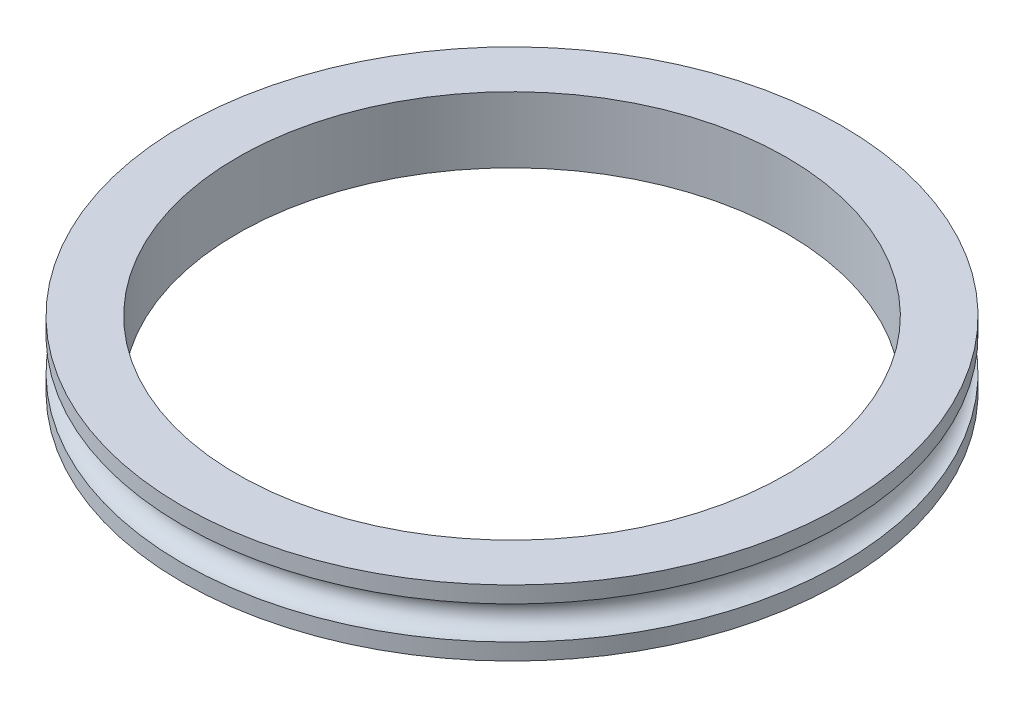
ISO-10303-21;
HEADER;
FILE_DESCRIPTION(('STEP AP214'),'2;1');
FILE_NAME('part.step','',(''),(''),'','','');
FILE_SCHEMA(('AUTOMOTIVE_DESIGN { 1 0 10303 214 1 1 1 1 }'));
ENDSEC;
DATA;
#1=APPLICATION_CONTEXT('core data for automotive mechanical design processes');
#2=APPLICATION_PROTOCOL_DEFINITION('international standard','automotive_design',2000,#1);
#3=PRODUCT_CONTEXT('',#1,'mechanical');
#4=PRODUCT('Part','Part','',(#3));
#5=PRODUCT_RELATED_PRODUCT_CATEGORY('part','',(#4));
#6=PRODUCT_DEFINITION_FORMATION('','',#4);
#7=PRODUCT_DEFINITION_CONTEXT('part definition',#1,'design');
#8=PRODUCT_DEFINITION('design','',#6,#7);
#9=PRODUCT_DEFINITION_SHAPE('','',#8);
#10=(LENGTH_UNIT() NAMED_UNIT(*) SI_UNIT(.MILLI.,.METRE.));
#11=(NAMED_UNIT(*) PLANE_ANGLE_UNIT() SI_UNIT($,.RADIAN.));
#12=(NAMED_UNIT(*) SI_UNIT($,.STERADIAN.) SOLID_ANGLE_UNIT());
#13=UNCERTAINTY_MEASURE_WITH_UNIT(LENGTH_MEASURE(1.E-05),#10,'distance_accuracy_value','');
#14=(GEOMETRIC_REPRESENTATION_CONTEXT(3) GLOBAL_UNCERTAINTY_ASSIGNED_CONTEXT((#13)) GLOBAL_UNIT_ASSIGNED_CONTEXT((#10,
#11,#12)) REPRESENTATION_CONTEXT('',''));
#15=CARTESIAN_POINT('',(0.,0.,0.));
#16=DIRECTION('',(0.,0.,1.));
#17=DIRECTION('',(1.,0.,0.));
#18=AXIS2_PLACEMENT_3D('',#15,#16,#17);
#19=CARTESIAN_POINT('',(0.,1.5,0.));
#20=DIRECTION('',(0.,-1.,0.));
#21=DIRECTION('',(0.,0.,-1.));
#22=AXIS2_PLACEMENT_3D('',#19,#20,#21);
#23=CYLINDRICAL_SURFACE('',#22,15.);
#24=CARTESIAN_POINT('',(0.,1.5,0.));
#25=DIRECTION('',(0.,1.,0.));
#26=DIRECTION('',(0.,0.,1.));
#27=AXIS2_PLACEMENT_3D('',#24,#25,#26);
#28=CIRCLE('',#27,15.);
#29=CARTESIAN_POINT('',(0.,1.5,15.));
#30=VERTEX_POINT('',#29);
#31=EDGE_CURVE('E10',#30,#30,#28,.T.);
#32=ORIENTED_EDGE('',*,*,#31,.F.);
#33=EDGE_LOOP('',(#32));
#34=FACE_BOUND('',#33,.T.);
#35=CARTESIAN_POINT('',(0.,0.750000000000003,0.));
#36=DIRECTION('',(0.,-1.,0.));
#37=DIRECTION('',(0.,0.,-1.));
#38=AXIS2_PLACEMENT_3D('',#35,#36,#37);
#39=CIRCLE('',#38,15.);
#40=CARTESIAN_POINT('',(0.,0.750000000000003,-15.));
#41=VERTEX_POINT('',#40);
#42=EDGE_CURVE('E34',#41,#41,#39,.T.);
#43=ORIENTED_EDGE('',*,*,#42,.F.);
#44=EDGE_LOOP('',(#43));
#45=FACE_BOUND('',#44,.T.);
#46=ADVANCED_FACE('F31',(#34,#45),#23,.T.);
#47=CARTESIAN_POINT('',(0.,1.5,0.));
#48=DIRECTION('',(0.,1.,0.));
#49=DIRECTION('',(0.,0.,1.));
#50=AXIS2_PLACEMENT_3D('',#47,#48,#49);
#51=PLANE('',#50);
#52=CARTESIAN_POINT('',(0.,1.5,0.));
#53=DIRECTION('',(0.,-1.,0.));
#54=DIRECTION('',(0.,0.,-1.));
#55=AXIS2_PLACEMENT_3D('',#52,#53,#54);
#56=CIRCLE('',#55,12.5);
#57=CARTESIAN_POINT('',(0.,1.5,-12.5));
#58=VERTEX_POINT('',#57);
#59=EDGE_CURVE('E49',#58,#58,#56,.T.);
#60=ORIENTED_EDGE('',*,*,#59,.T.);
#61=EDGE_LOOP('',(#60));
#62=FACE_BOUND('',#61,.T.);
#63=ORIENTED_EDGE('',*,*,#31,.T.);
#64=EDGE_LOOP('',(#63));
#65=FACE_BOUND('',#64,.T.);
#66=ADVANCED_FACE('F76',(#62,#65),#51,.T.);
#67=CARTESIAN_POINT('',(0.,0.,0.));
#68=DIRECTION('',(0.,1.,0.));
#69=DIRECTION('',(0.,0.,1.));
#70=AXIS2_PLACEMENT_3D('',#67,#68,#69);
#71=TOROIDAL_SURFACE('',#70,15.,0.750000000000002);
#72=CARTESIAN_POINT('',(0.,-0.750000000000001,0.));
#73=DIRECTION('',(0.,1.,0.));
#74=DIRECTION('',(0.,0.,1.));
#75=AXIS2_PLACEMENT_3D('',#72,#73,#74);
#76=CIRCLE('',#75,15.);
#77=CARTESIAN_POINT('',(0.,-0.750000000000001,15.));
#78=VERTEX_POINT('',#77);
#79=EDGE_CURVE('E47',#78,#78,#76,.T.);
#80=ORIENTED_EDGE('',*,*,#79,.T.);
#81=EDGE_LOOP('',(#80));
#82=FACE_BOUND('',#81,.T.);
#83=ORIENTED_EDGE('',*,*,#42,.T.);
#84=EDGE_LOOP('',(#83));
#85=FACE_BOUND('',#84,.T.);
#86=ADVANCED_FACE('F65',(#82,#85),#71,.F.);
#87=CARTESIAN_POINT('',(0.,-1.5,0.));
#88=DIRECTION('',(0.,1.,0.));
#89=DIRECTION('',(0.,0.,1.));
#90=AXIS2_PLACEMENT_3D('',#87,#88,#89);
#91=PLANE('',#90);
#92=CARTESIAN_POINT('',(0.,-1.5,0.));
#93=DIRECTION('',(0.,-1.,0.));
#94=DIRECTION('',(0.,0.,-1.));
#95=AXIS2_PLACEMENT_3D('',#92,#93,#94);
#96=CIRCLE('',#95,12.5);
#97=CARTESIAN_POINT('',(0.,-1.5,-12.5));
#98=VERTEX_POINT('',#97);
#99=EDGE_CURVE('E45',#98,#98,#96,.T.);
#100=ORIENTED_EDGE('',*,*,#99,.F.);
#101=EDGE_LOOP('',(#100));
#102=FACE_BOUND('',#101,.T.);
#103=CARTESIAN_POINT('',(0.,-1.5,0.));
#104=DIRECTION('',(0.,1.,0.));
#105=DIRECTION('',(0.,0.,1.));
#106=AXIS2_PLACEMENT_3D('',#103,#104,#105);
#107=CIRCLE('',#106,15.);
#108=CARTESIAN_POINT('',(0.,-1.5,15.));
#109=VERTEX_POINT('',#108);
#110=EDGE_CURVE('E38',#109,#109,#107,.T.);
#111=ORIENTED_EDGE('',*,*,#110,.F.);
#112=EDGE_LOOP('',(#111));
#113=FACE_BOUND('',#112,.T.);
#114=ADVANCED_FACE('F61',(#102,#113),#91,.F.);
#115=ORIENTED_EDGE('',*,*,#110,.T.);
#116=EDGE_LOOP('',(#115));
#117=FACE_BOUND('',#116,.T.);
#118=ORIENTED_EDGE('',*,*,#79,.F.);
#119=EDGE_LOOP('',(#118));
#120=FACE_BOUND('',#119,.T.);
#121=ADVANCED_FACE('F64',(#117,#120),#23,.T.);
#122=CARTESIAN_POINT('',(0.,1.5,0.));
#123=DIRECTION('',(0.,-1.,0.));
#124=DIRECTION('',(0.,0.,-1.));
#125=AXIS2_PLACEMENT_3D('',#122,#123,#124);
#126=CYLINDRICAL_SURFACE('',#125,12.5);
#127=ORIENTED_EDGE('',*,*,#59,.F.);
#128=EDGE_LOOP('',(#127));
#129=FACE_BOUND('',#128,.T.);
#130=ORIENTED_EDGE('',*,*,#99,.T.);
#131=EDGE_LOOP('',(#130));
#132=FACE_BOUND('',#131,.T.);
#133=ADVANCED_FACE('F59',(#129,#132),#126,.F.);
#134=CLOSED_SHELL('',(#46,#66,#86,#114,#121,#133));
#135=MANIFOLD_SOLID_BREP('B2',#134);
#136=ADVANCED_BREP_SHAPE_REPRESENTATION('',(#18,#135),#14);
#137=SHAPE_DEFINITION_REPRESENTATION(#9,#136);
ENDSEC;
END-ISO-10303-21;
